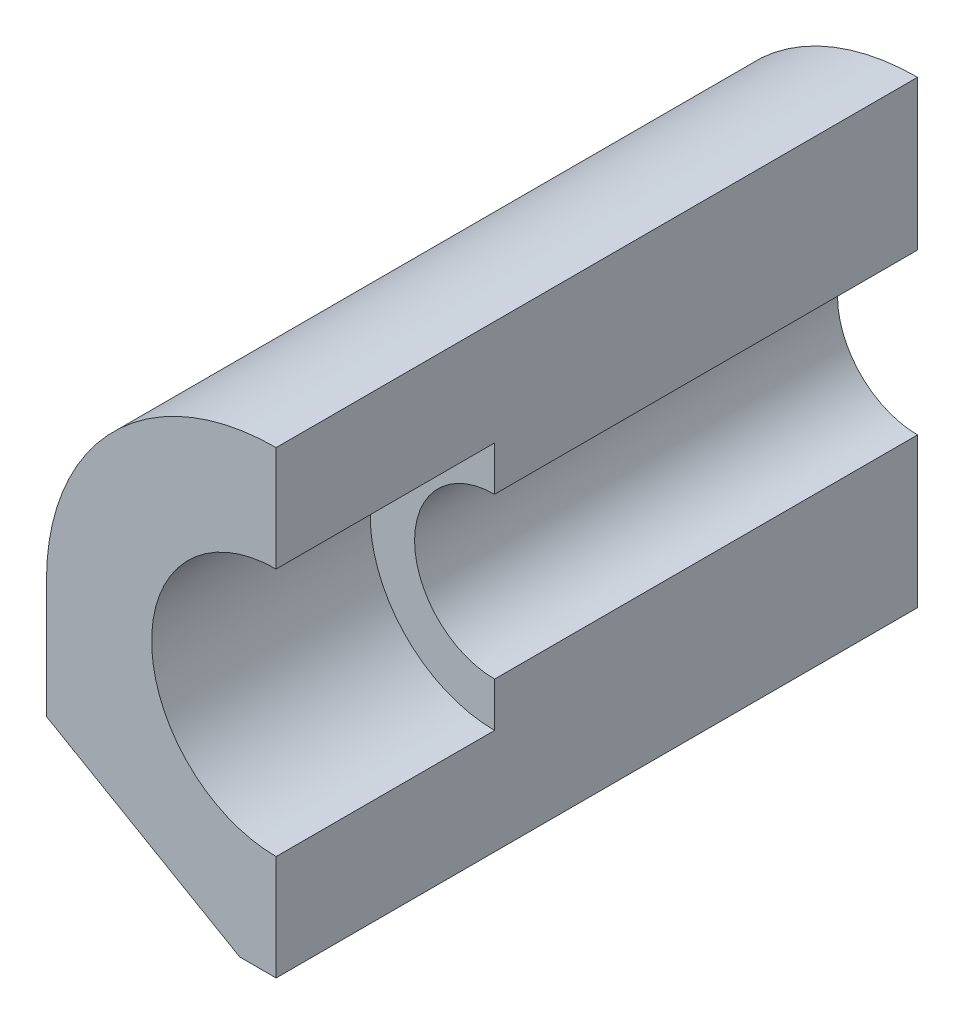
ISO-10303-21;
HEADER;
FILE_DESCRIPTION(('STEP AP214'),'2;1');
FILE_NAME('part.step','',(''),(''),'','','');
FILE_SCHEMA(('AUTOMOTIVE_DESIGN { 1 0 10303 214 1 1 1 1 }'));
ENDSEC;
DATA;
#1=APPLICATION_CONTEXT('core data for automotive mechanical design processes');
#2=APPLICATION_PROTOCOL_DEFINITION('international standard','automotive_design',2000,#1);
#3=PRODUCT_CONTEXT('',#1,'mechanical');
#4=PRODUCT('Part','Part','',(#3));
#5=PRODUCT_RELATED_PRODUCT_CATEGORY('part','',(#4));
#6=PRODUCT_DEFINITION_FORMATION('','',#4);
#7=PRODUCT_DEFINITION_CONTEXT('part definition',#1,'design');
#8=PRODUCT_DEFINITION('design','',#6,#7);
#9=PRODUCT_DEFINITION_SHAPE('','',#8);
#10=(LENGTH_UNIT() NAMED_UNIT(*) SI_UNIT(.MILLI.,.METRE.));
#11=(NAMED_UNIT(*) PLANE_ANGLE_UNIT() SI_UNIT($,.RADIAN.));
#12=(NAMED_UNIT(*) SI_UNIT($,.STERADIAN.) SOLID_ANGLE_UNIT());
#13=UNCERTAINTY_MEASURE_WITH_UNIT(LENGTH_MEASURE(1.E-05),#10,'distance_accuracy_value','');
#14=(GEOMETRIC_REPRESENTATION_CONTEXT(3) GLOBAL_UNCERTAINTY_ASSIGNED_CONTEXT((#13)) GLOBAL_UNIT_ASSIGNED_CONTEXT((#10,
#11,#12)) REPRESENTATION_CONTEXT('',''));
#15=CARTESIAN_POINT('',(0.,0.,0.));
#16=DIRECTION('',(0.,0.,1.));
#17=DIRECTION('',(1.,0.,0.));
#18=AXIS2_PLACEMENT_3D('',#15,#16,#17);
#19=CARTESIAN_POINT('',(0.,0.,229.));
#20=DIRECTION('',(-1.,0.,0.));
#21=DIRECTION('',(0.,0.,1.));
#22=AXIS2_PLACEMENT_3D('',#19,#20,#21);
#23=PLANE('',#22);
#24=DIRECTION('',(0.,1.,0.));
#25=VECTOR('',#24,1.);
#26=CARTESIAN_POINT('',(0.,0.,0.));
#27=LINE('',#26,#25);
#28=CARTESIAN_POINT('',(0.,0.,0.));
#29=VERTEX_POINT('',#28);
#30=CARTESIAN_POINT('',(0.,53.425,0.));
#31=VERTEX_POINT('',#30);
#32=EDGE_CURVE('E134',#29,#31,#27,.T.);
#33=ORIENTED_EDGE('',*,*,#32,.T.);
#34=DIRECTION('',(0.,0.,1.));
#35=VECTOR('',#34,1.);
#36=CARTESIAN_POINT('',(0.,53.425,0.));
#37=LINE('',#36,#35);
#38=CARTESIAN_POINT('',(0.,53.425,151.));
#39=VERTEX_POINT('',#38);
#40=EDGE_CURVE('E117',#31,#39,#37,.T.);
#41=ORIENTED_EDGE('',*,*,#40,.T.);
#42=DIRECTION('',(0.,1.,0.));
#43=VECTOR('',#42,1.);
#44=CARTESIAN_POINT('',(0.,0.,151.));
#45=LINE('',#44,#43);
#46=CARTESIAN_POINT('',(0.,37.55,151.));
#47=VERTEX_POINT('',#46);
#48=EDGE_CURVE('E13',#47,#39,#45,.T.);
#49=ORIENTED_EDGE('',*,*,#48,.F.);
#50=DIRECTION('',(0.,0.,1.));
#51=VECTOR('',#50,1.);
#52=CARTESIAN_POINT('',(0.,37.55,151.));
#53=LINE('',#52,#51);
#54=CARTESIAN_POINT('',(0.,37.55,229.));
#55=VERTEX_POINT('',#54);
#56=EDGE_CURVE('E138',#47,#55,#53,.T.);
#57=ORIENTED_EDGE('',*,*,#56,.T.);
#58=DIRECTION('',(0.,1.,0.));
#59=VECTOR('',#58,1.);
#60=CARTESIAN_POINT('',(0.,0.,229.));
#61=LINE('',#60,#59);
#62=CARTESIAN_POINT('',(0.,0.,229.));
#63=VERTEX_POINT('',#62);
#64=EDGE_CURVE('E180',#63,#55,#61,.T.);
#65=ORIENTED_EDGE('',*,*,#64,.F.);
#66=DIRECTION('',(0.,0.,-1.));
#67=VECTOR('',#66,1.);
#68=CARTESIAN_POINT('',(0.,0.,229.));
#69=LINE('',#68,#67);
#70=EDGE_CURVE('E159',#63,#29,#69,.T.);
#71=ORIENTED_EDGE('',*,*,#70,.T.);
#72=EDGE_LOOP('',(#33,#41,#49,#57,#65,#71));
#73=FACE_BOUND('',#72,.T.);
#74=ADVANCED_FACE('F44',(#73),#23,.F.);
#75=CARTESIAN_POINT('',(-13.,0.,229.));
#76=DIRECTION('',(0.,1.,0.));
#77=DIRECTION('',(0.,0.,1.));
#78=AXIS2_PLACEMENT_3D('',#75,#76,#77);
#79=PLANE('',#78);
#80=DIRECTION('',(1.,0.,0.));
#81=VECTOR('',#80,1.);
#82=CARTESIAN_POINT('',(-13.,0.,0.));
#83=LINE('',#82,#81);
#84=CARTESIAN_POINT('',(-13.,0.,0.));
#85=VERTEX_POINT('',#84);
#86=EDGE_CURVE('E135',#85,#29,#83,.T.);
#87=ORIENTED_EDGE('',*,*,#86,.T.);
#88=ORIENTED_EDGE('',*,*,#70,.F.);
#89=DIRECTION('',(1.,0.,0.));
#90=VECTOR('',#89,1.);
#91=CARTESIAN_POINT('',(-13.,0.,229.));
#92=LINE('',#91,#90);
#93=CARTESIAN_POINT('',(-13.,0.,229.));
#94=VERTEX_POINT('',#93);
#95=EDGE_CURVE('E147',#94,#63,#92,.T.);
#96=ORIENTED_EDGE('',*,*,#95,.F.);
#97=DIRECTION('',(0.,0.,-1.));
#98=VECTOR('',#97,1.);
#99=CARTESIAN_POINT('',(-13.,0.,229.));
#100=LINE('',#99,#98);
#101=EDGE_CURVE('E148',#94,#85,#100,.T.);
#102=ORIENTED_EDGE('',*,*,#101,.T.);
#103=EDGE_LOOP('',(#87,#88,#96,#102));
#104=FACE_BOUND('',#103,.T.);
#105=ADVANCED_FACE('F46',(#104),#79,.F.);
#106=CARTESIAN_POINT('',(0.,110.575,151.));
#107=VERTEX_POINT('',#106);
#108=CARTESIAN_POINT('',(0.,126.45,151.));
#109=VERTEX_POINT('',#108);
#110=EDGE_CURVE('E52',#107,#109,#45,.T.);
#111=ORIENTED_EDGE('',*,*,#110,.F.);
#112=DIRECTION('',(0.,0.,1.));
#113=VECTOR('',#112,1.);
#114=CARTESIAN_POINT('',(0.,110.575,0.));
#115=LINE('',#114,#113);
#116=CARTESIAN_POINT('',(0.,110.575,0.));
#117=VERTEX_POINT('',#116);
#118=EDGE_CURVE('E59',#107,#117,#115,.F.);
#119=ORIENTED_EDGE('',*,*,#118,.T.);
#120=CARTESIAN_POINT('',(0.,164.,0.));
#121=VERTEX_POINT('',#120);
#122=EDGE_CURVE('E127',#117,#121,#27,.T.);
#123=ORIENTED_EDGE('',*,*,#122,.T.);
#124=DIRECTION('',(0.,0.,-1.));
#125=VECTOR('',#124,1.);
#126=CARTESIAN_POINT('',(0.,164.,229.));
#127=LINE('',#126,#125);
#128=CARTESIAN_POINT('',(0.,164.,229.));
#129=VERTEX_POINT('',#128);
#130=EDGE_CURVE('E158',#129,#121,#127,.T.);
#131=ORIENTED_EDGE('',*,*,#130,.F.);
#132=CARTESIAN_POINT('',(0.,126.45,229.));
#133=VERTEX_POINT('',#132);
#134=EDGE_CURVE('E173',#133,#129,#61,.T.);
#135=ORIENTED_EDGE('',*,*,#134,.F.);
#136=DIRECTION('',(0.,0.,1.));
#137=VECTOR('',#136,1.);
#138=CARTESIAN_POINT('',(0.,126.45,151.));
#139=LINE('',#138,#137);
#140=EDGE_CURVE('E67',#133,#109,#139,.F.);
#141=ORIENTED_EDGE('',*,*,#140,.T.);
#142=EDGE_LOOP('',(#111,#119,#123,#131,#135,#141));
#143=FACE_BOUND('',#142,.T.);
#144=ADVANCED_FACE('F125',(#143),#23,.F.);
#145=CARTESIAN_POINT('',(0.,82.,229.));
#146=DIRECTION('',(0.,0.,-1.));
#147=DIRECTION('',(-1.,0.,0.));
#148=AXIS2_PLACEMENT_3D('',#145,#146,#147);
#149=CYLINDRICAL_SURFACE('',#148,82.);
#150=CARTESIAN_POINT('',(0.,82.,0.));
#151=DIRECTION('',(0.,0.,1.));
#152=DIRECTION('',(1.,0.,0.));
#153=AXIS2_PLACEMENT_3D('',#150,#151,#152);
#154=CIRCLE('',#153,82.);
#155=CARTESIAN_POINT('',(-82.,82.,0.));
#156=VERTEX_POINT('',#155);
#157=EDGE_CURVE('E133',#121,#156,#154,.T.);
#158=ORIENTED_EDGE('',*,*,#157,.T.);
#159=DIRECTION('',(0.,0.,-1.));
#160=VECTOR('',#159,1.);
#161=CARTESIAN_POINT('',(-82.,82.,229.));
#162=LINE('',#161,#160);
#163=CARTESIAN_POINT('',(-82.,82.,229.));
#164=VERTEX_POINT('',#163);
#165=EDGE_CURVE('E155',#164,#156,#162,.T.);
#166=ORIENTED_EDGE('',*,*,#165,.F.);
#167=CARTESIAN_POINT('',(0.,82.,229.));
#168=DIRECTION('',(0.,0.,1.));
#169=DIRECTION('',(1.,0.,0.));
#170=AXIS2_PLACEMENT_3D('',#167,#168,#169);
#171=CIRCLE('',#170,82.);
#172=EDGE_CURVE('E183',#129,#164,#171,.T.);
#173=ORIENTED_EDGE('',*,*,#172,.F.);
#174=ORIENTED_EDGE('',*,*,#130,.T.);
#175=EDGE_LOOP('',(#158,#166,#173,#174));
#176=FACE_BOUND('',#175,.T.);
#177=ADVANCED_FACE('F203',(#176),#149,.T.);
#178=CARTESIAN_POINT('',(-82.,82.,229.));
#179=DIRECTION('',(1.,0.,0.));
#180=DIRECTION('',(0.,1.,0.));
#181=AXIS2_PLACEMENT_3D('',#178,#179,#180);
#182=PLANE('',#181);
#183=DIRECTION('',(0.,-1.,0.));
#184=VECTOR('',#183,1.);
#185=CARTESIAN_POINT('',(-82.,82.,0.));
#186=LINE('',#185,#184);
#187=CARTESIAN_POINT('',(-82.,39.8371685740843,0.));
#188=VERTEX_POINT('',#187);
#189=EDGE_CURVE('E143',#156,#188,#186,.T.);
#190=ORIENTED_EDGE('',*,*,#189,.T.);
#191=DIRECTION('',(0.,0.,-1.));
#192=VECTOR('',#191,1.);
#193=CARTESIAN_POINT('',(-82.,39.8371685740843,229.));
#194=LINE('',#193,#192);
#195=CARTESIAN_POINT('',(-82.,39.8371685740843,229.));
#196=VERTEX_POINT('',#195);
#197=EDGE_CURVE('E151',#196,#188,#194,.T.);
#198=ORIENTED_EDGE('',*,*,#197,.F.);
#199=DIRECTION('',(0.,-1.,0.));
#200=VECTOR('',#199,1.);
#201=CARTESIAN_POINT('',(-82.,82.,229.));
#202=LINE('',#201,#200);
#203=EDGE_CURVE('E185',#164,#196,#202,.T.);
#204=ORIENTED_EDGE('',*,*,#203,.F.);
#205=ORIENTED_EDGE('',*,*,#165,.T.);
#206=EDGE_LOOP('',(#190,#198,#204,#205));
#207=FACE_BOUND('',#206,.T.);
#208=ADVANCED_FACE('F205',(#207),#182,.F.);
#209=CARTESIAN_POINT('',(-82.,39.8371685740843,229.));
#210=DIRECTION('',(0.500000000000001,0.866025403784438,0.));
#211=DIRECTION('',(-0.866025403784438,0.500000000000001,0.));
#212=AXIS2_PLACEMENT_3D('',#209,#210,#211);
#213=PLANE('',#212);
#214=DIRECTION('',(0.866025403784438,-0.500000000000001,0.));
#215=VECTOR('',#214,1.);
#216=CARTESIAN_POINT('',(-82.,39.8371685740843,0.));
#217=LINE('',#216,#215);
#218=EDGE_CURVE('E145',#188,#85,#217,.T.);
#219=ORIENTED_EDGE('',*,*,#218,.T.);
#220=ORIENTED_EDGE('',*,*,#101,.F.);
#221=DIRECTION('',(0.866025403784438,-0.500000000000001,0.));
#222=VECTOR('',#221,1.);
#223=CARTESIAN_POINT('',(-82.,39.8371685740843,229.));
#224=LINE('',#223,#222);
#225=EDGE_CURVE('E152',#196,#94,#224,.T.);
#226=ORIENTED_EDGE('',*,*,#225,.F.);
#227=ORIENTED_EDGE('',*,*,#197,.T.);
#228=EDGE_LOOP('',(#219,#220,#226,#227));
#229=FACE_BOUND('',#228,.T.);
#230=ADVANCED_FACE('F194',(#229),#213,.F.);
#231=CARTESIAN_POINT('',(0.,82.,229.));
#232=DIRECTION('',(0.,0.,1.));
#233=DIRECTION('',(1.,0.,0.));
#234=AXIS2_PLACEMENT_3D('',#231,#232,#233);
#235=PLANE('',#234);
#236=CARTESIAN_POINT('',(0.,82.,229.));
#237=DIRECTION('',(0.,0.,1.));
#238=DIRECTION('',(1.,0.,0.));
#239=AXIS2_PLACEMENT_3D('',#236,#237,#238);
#240=CIRCLE('',#239,44.45);
#241=EDGE_CURVE('E170',#133,#55,#240,.T.);
#242=ORIENTED_EDGE('',*,*,#241,.F.);
#243=ORIENTED_EDGE('',*,*,#134,.T.);
#244=ORIENTED_EDGE('',*,*,#172,.T.);
#245=ORIENTED_EDGE('',*,*,#203,.T.);
#246=ORIENTED_EDGE('',*,*,#225,.T.);
#247=ORIENTED_EDGE('',*,*,#95,.T.);
#248=ORIENTED_EDGE('',*,*,#64,.T.);
#249=EDGE_LOOP('',(#242,#243,#244,#245,#246,#247,#248));
#250=FACE_BOUND('',#249,.T.);
#251=ADVANCED_FACE('F189',(#250),#235,.T.);
#252=CARTESIAN_POINT('',(0.,82.,0.));
#253=DIRECTION('',(0.,0.,1.));
#254=DIRECTION('',(1.,0.,0.));
#255=AXIS2_PLACEMENT_3D('',#252,#253,#254);
#256=PLANE('',#255);
#257=ORIENTED_EDGE('',*,*,#122,.F.);
#258=CARTESIAN_POINT('',(0.,82.,0.));
#259=DIRECTION('',(0.,0.,1.));
#260=DIRECTION('',(1.,0.,0.));
#261=AXIS2_PLACEMENT_3D('',#258,#259,#260);
#262=CIRCLE('',#261,28.575);
#263=EDGE_CURVE('E114',#117,#31,#262,.T.);
#264=ORIENTED_EDGE('',*,*,#263,.T.);
#265=ORIENTED_EDGE('',*,*,#32,.F.);
#266=ORIENTED_EDGE('',*,*,#86,.F.);
#267=ORIENTED_EDGE('',*,*,#218,.F.);
#268=ORIENTED_EDGE('',*,*,#189,.F.);
#269=ORIENTED_EDGE('',*,*,#157,.F.);
#270=EDGE_LOOP('',(#257,#264,#265,#266,#267,#268,#269));
#271=FACE_BOUND('',#270,.T.);
#272=ADVANCED_FACE('F131',(#271),#256,.F.);
#273=CARTESIAN_POINT('',(0.,82.,151.));
#274=DIRECTION('',(0.,0.,1.));
#275=DIRECTION('',(1.,0.,0.));
#276=AXIS2_PLACEMENT_3D('',#273,#274,#275);
#277=PLANE('',#276);
#278=CARTESIAN_POINT('',(0.,82.,151.));
#279=DIRECTION('',(0.,0.,1.));
#280=DIRECTION('',(1.,0.,0.));
#281=AXIS2_PLACEMENT_3D('',#278,#279,#280);
#282=CIRCLE('',#281,28.575);
#283=EDGE_CURVE('E121',#107,#39,#282,.T.);
#284=ORIENTED_EDGE('',*,*,#283,.F.);
#285=ORIENTED_EDGE('',*,*,#110,.T.);
#286=CARTESIAN_POINT('',(0.,82.,151.));
#287=DIRECTION('',(0.,0.,1.));
#288=DIRECTION('',(1.,0.,0.));
#289=AXIS2_PLACEMENT_3D('',#286,#287,#288);
#290=CIRCLE('',#289,44.45);
#291=EDGE_CURVE('E166',#109,#47,#290,.T.);
#292=ORIENTED_EDGE('',*,*,#291,.T.);
#293=ORIENTED_EDGE('',*,*,#48,.T.);
#294=EDGE_LOOP('',(#284,#285,#292,#293));
#295=FACE_BOUND('',#294,.T.);
#296=ADVANCED_FACE('F165',(#295),#277,.T.);
#297=CARTESIAN_POINT('',(0.,82.,151.));
#298=DIRECTION('',(0.,0.,1.));
#299=DIRECTION('',(1.,0.,0.));
#300=AXIS2_PLACEMENT_3D('',#297,#298,#299);
#301=CYLINDRICAL_SURFACE('',#300,44.45);
#302=ORIENTED_EDGE('',*,*,#291,.F.);
#303=ORIENTED_EDGE('',*,*,#140,.F.);
#304=ORIENTED_EDGE('',*,*,#241,.T.);
#305=ORIENTED_EDGE('',*,*,#56,.F.);
#306=EDGE_LOOP('',(#302,#303,#304,#305));
#307=FACE_BOUND('',#306,.T.);
#308=ADVANCED_FACE('F168',(#307),#301,.F.);
#309=CARTESIAN_POINT('',(0.,82.,0.));
#310=DIRECTION('',(0.,0.,1.));
#311=DIRECTION('',(1.,0.,0.));
#312=AXIS2_PLACEMENT_3D('',#309,#310,#311);
#313=CYLINDRICAL_SURFACE('',#312,28.575);
#314=ORIENTED_EDGE('',*,*,#263,.F.);
#315=ORIENTED_EDGE('',*,*,#118,.F.);
#316=ORIENTED_EDGE('',*,*,#283,.T.);
#317=ORIENTED_EDGE('',*,*,#40,.F.);
#318=EDGE_LOOP('',(#314,#315,#316,#317));
#319=FACE_BOUND('',#318,.T.);
#320=ADVANCED_FACE('F115',(#319),#313,.F.);
#321=CLOSED_SHELL('',(#74,#105,#144,#177,#208,#230,#251,#272,#296,#308,#320));
#322=MANIFOLD_SOLID_BREP('B2',#321);
#323=ADVANCED_BREP_SHAPE_REPRESENTATION('',(#18,#322),#14);
#324=SHAPE_DEFINITION_REPRESENTATION(#9,#323);
ENDSEC;
END-ISO-10303-21;
